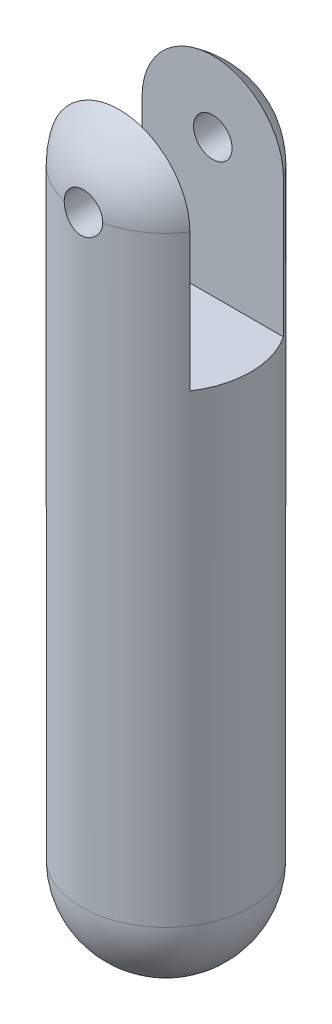
ISO-10303-21;
HEADER;
FILE_DESCRIPTION(('STEP AP214'),'2;1');
FILE_NAME('part.step','',(''),(''),'','','');
FILE_SCHEMA(('AUTOMOTIVE_DESIGN { 1 0 10303 214 1 1 1 1 }'));
ENDSEC;
DATA;
#1=APPLICATION_CONTEXT('core data for automotive mechanical design processes');
#2=APPLICATION_PROTOCOL_DEFINITION('international standard','automotive_design',2000,#1);
#3=PRODUCT_CONTEXT('',#1,'mechanical');
#4=PRODUCT('Part','Part','',(#3));
#5=PRODUCT_RELATED_PRODUCT_CATEGORY('part','',(#4));
#6=PRODUCT_DEFINITION_FORMATION('','',#4);
#7=PRODUCT_DEFINITION_CONTEXT('part definition',#1,'design');
#8=PRODUCT_DEFINITION('design','',#6,#7);
#9=PRODUCT_DEFINITION_SHAPE('','',#8);
#10=(LENGTH_UNIT() NAMED_UNIT(*) SI_UNIT(.MILLI.,.METRE.));
#11=(NAMED_UNIT(*) PLANE_ANGLE_UNIT() SI_UNIT($,.RADIAN.));
#12=(NAMED_UNIT(*) SI_UNIT($,.STERADIAN.) SOLID_ANGLE_UNIT());
#13=UNCERTAINTY_MEASURE_WITH_UNIT(LENGTH_MEASURE(1.E-05),#10,'distance_accuracy_value','');
#14=(GEOMETRIC_REPRESENTATION_CONTEXT(3) GLOBAL_UNCERTAINTY_ASSIGNED_CONTEXT((#13)) GLOBAL_UNIT_ASSIGNED_CONTEXT((#10,
#11,#12)) REPRESENTATION_CONTEXT('',''));
#15=CARTESIAN_POINT('',(0.,0.,0.));
#16=DIRECTION('',(0.,0.,1.));
#17=DIRECTION('',(1.,0.,0.));
#18=AXIS2_PLACEMENT_3D('',#15,#16,#17);
#19=CARTESIAN_POINT('',(0.,0.,0.));
#20=DIRECTION('',(0.,-1.,0.));
#21=DIRECTION('',(1.,0.,0.));
#22=AXIS2_PLACEMENT_3D('',#19,#20,#21);
#23=CYLINDRICAL_SURFACE('',#22,1.9558);
#24=CARTESIAN_POINT('',(0.,-13.8684,0.));
#25=DIRECTION('',(0.,-1.,0.));
#26=DIRECTION('',(1.,0.,0.));
#27=AXIS2_PLACEMENT_3D('',#24,#25,#26);
#28=CIRCLE('',#27,1.9558);
#29=CARTESIAN_POINT('',(1.9558,-13.8684,0.));
#30=VERTEX_POINT('',#29);
#31=EDGE_CURVE('E107',#30,#30,#28,.T.);
#32=ORIENTED_EDGE('',*,*,#31,.F.);
#33=EDGE_LOOP('',(#32));
#34=FACE_BOUND('',#33,.T.);
#35=CARTESIAN_POINT('',(0.,0.,0.));
#36=DIRECTION('',(0.,-1.,0.));
#37=DIRECTION('',(1.,0.,0.));
#38=AXIS2_PLACEMENT_3D('',#35,#36,#37);
#39=CIRCLE('',#38,1.9558);
#40=CARTESIAN_POINT('',(1.63089956465749,0.,1.0795));
#41=VERTEX_POINT('',#40);
#42=CARTESIAN_POINT('',(0.4445,0.,1.90461896189238));
#43=VERTEX_POINT('',#42);
#44=EDGE_CURVE('E93',#41,#43,#39,.T.);
#45=ORIENTED_EDGE('',*,*,#44,.T.);
#46=CARTESIAN_POINT('',(0.4445,0.,1.90461896189238));
#47=CARTESIAN_POINT('',(0.44452273001284,-0.0246635968022245,1.90460001005423));
#48=CARTESIAN_POINT('',(0.442448800622915,-0.0493134063288643,1.90509753542933));
#49=CARTESIAN_POINT('',(0.434284365112343,-0.0978598865842544,1.90698240428573));
#50=CARTESIAN_POINT('',(0.42820112347571,-0.121757837707106,1.90836813829481));
#51=CARTESIAN_POINT('',(0.412193611376415,-0.168169204235372,1.91188725232877));
#52=CARTESIAN_POINT('',(0.402269321359488,-0.190682612591588,1.91402063615983));
#53=CARTESIAN_POINT('',(0.378879685436702,-0.233731370625052,1.91878783812066));
#54=CARTESIAN_POINT('',(0.365413669515942,-0.254266345021712,1.92142175091306));
#55=CARTESIAN_POINT('',(0.33506218365826,-0.293140943529835,1.92694779611436));
#56=CARTESIAN_POINT('',(0.318124709604863,-0.311439476578559,1.92984342871888));
#57=CARTESIAN_POINT('',(0.281422139972595,-0.344963277211342,1.93553600091458));
#58=CARTESIAN_POINT('',(0.261656600772462,-0.360188061730215,1.93833292493596));
#59=CARTESIAN_POINT('',(0.219580718133937,-0.387295530073583,1.94355131390343));
#60=CARTESIAN_POINT('',(0.197243959734308,-0.399138183030924,1.94596814080593));
#61=CARTESIAN_POINT('',(0.150834283476316,-0.418885372056951,1.95011400631086));
#62=CARTESIAN_POINT('',(0.126761666981976,-0.426790589832237,1.95184316396223));
#63=CARTESIAN_POINT('',(0.0779932409427805,-0.438308600582936,1.95439417745114));
#64=CARTESIAN_POINT('',(0.0533147789880289,-0.441991510205409,1.95523083749664));
#65=CARTESIAN_POINT('',(0.00367648660715528,-0.445179834956215,1.95595396454403));
#66=CARTESIAN_POINT('',(-0.0212833153022637,-0.444685669738405,1.95584052699841));
#67=CARTESIAN_POINT('',(-0.0702904622039241,-0.439585468587378,1.95468744165034));
#68=CARTESIAN_POINT('',(-0.0943461461723642,-0.435055134472248,1.95366484660914));
#69=CARTESIAN_POINT('',(-0.141346393355104,-0.422132141926034,1.95082789725655));
#70=CARTESIAN_POINT('',(-0.164290912841336,-0.413739331629783,1.94901351181361));
#71=CARTESIAN_POINT('',(-0.208625393672722,-0.393264054755667,1.94476974181478));
#72=CARTESIAN_POINT('',(-0.230001823601263,-0.381153301022523,1.94233566761055));
#73=CARTESIAN_POINT('',(-0.270445708646846,-0.353607386211707,1.93711878216214));
#74=CARTESIAN_POINT('',(-0.289512889181942,-0.338171830402625,1.93433592952628));
#75=CARTESIAN_POINT('',(-0.325246204687189,-0.304006145887558,1.92865332755163));
#76=CARTESIAN_POINT('',(-0.341849208181335,-0.285210139029779,1.92575235553995));
#77=CARTESIAN_POINT('',(-0.371684010430429,-0.245064644347421,1.92021760097455));
#78=CARTESIAN_POINT('',(-0.384914887550258,-0.223714460779131,1.91758389158443));
#79=CARTESIAN_POINT('',(-0.407661789140926,-0.178955657272013,1.91287780095361));
#80=CARTESIAN_POINT('',(-0.417162924718296,-0.155539235276379,1.9108076793914));
#81=CARTESIAN_POINT('',(-0.4320631439304,-0.10739818988529,1.90749425404484));
#82=CARTESIAN_POINT('',(-0.437468339165815,-0.0826755746779893,1.90624971874064));
#83=CARTESIAN_POINT('',(-0.441993413307874,-0.0481221100137197,1.90520248188666));
#84=CARTESIAN_POINT('',(-0.442933630257451,-0.0385148214803054,1.90498395072954));
#85=CARTESIAN_POINT('',(-0.444186174887239,-0.0192731734323209,1.90469228402986));
#86=CARTESIAN_POINT('',(-0.444499539564846,-0.00963888507402481,1.90461890835981));
#87=CARTESIAN_POINT('',(-0.444500000000006,0.,1.90461896189246));
#88=B_SPLINE_CURVE_WITH_KNOTS('',3,(#46,#47,#48,#49,#50,#51,#52,#53,#54,#55,#56,#57,#58,#59,#60,
#61,#62,#63,#64,#65,#66,#67,#68,#69,#70,#71,#72,#73,#74,#75,#76,#77,#78,#79,#80,#81,#82,#83,#84,
#85,#86,#87),.UNSPECIFIED.,.F.,.F.,(4,2,2,2,2,2,2,2,2,2,2,2,2,2,2,2,2,2,2,2,4),(0.,
0.073877677664881,0.147621862809744,0.221366423381347,0.29512494481257,0.370081890302293,
0.445050606746095,0.520872997321321,0.596682255843713,0.671213492685012,0.745737241762632,
0.818891989685503,0.892049614158744,0.965778247488477,1.03951563895285,1.11489978317361,
1.19030450857748,1.26600725619818,1.34159682322518,1.37054688810836,1.39944902136113),.UNSPECIFIED.);
#89=CARTESIAN_POINT('',(-0.4445,0.,1.90461896189238));
#90=VERTEX_POINT('',#89);
#91=EDGE_CURVE('E57',#43,#90,#88,.T.);
#92=ORIENTED_EDGE('',*,*,#91,.T.);
#93=CARTESIAN_POINT('',(-1.63089956465749,0.,1.0795));
#94=VERTEX_POINT('',#93);
#95=EDGE_CURVE('E89',#90,#94,#39,.T.);
#96=ORIENTED_EDGE('',*,*,#95,.T.);
#97=DIRECTION('',(0.,-1.,0.));
#98=VECTOR('',#97,1.);
#99=CARTESIAN_POINT('',(-1.63089956465749,0.,1.0795));
#100=LINE('',#99,#98);
#101=CARTESIAN_POINT('',(-1.63089956465749,-3.175,1.0795));
#102=VERTEX_POINT('',#101);
#103=EDGE_CURVE('E121',#94,#102,#100,.T.);
#104=ORIENTED_EDGE('',*,*,#103,.T.);
#105=CARTESIAN_POINT('',(0.,-3.175,0.));
#106=DIRECTION('',(0.,1.,0.));
#107=DIRECTION('',(0.,0.,1.));
#108=AXIS2_PLACEMENT_3D('',#105,#106,#107);
#109=CIRCLE('',#108,1.9558);
#110=CARTESIAN_POINT('',(-1.63089956465749,-3.175,-1.0795));
#111=VERTEX_POINT('',#110);
#112=EDGE_CURVE('E11',#111,#102,#109,.T.);
#113=ORIENTED_EDGE('',*,*,#112,.F.);
#114=DIRECTION('',(0.,-1.,0.));
#115=VECTOR('',#114,1.);
#116=CARTESIAN_POINT('',(-1.63089956465749,0.,-1.0795));
#117=LINE('',#116,#115);
#118=CARTESIAN_POINT('',(-1.63089956465749,0.,-1.0795));
#119=VERTEX_POINT('',#118);
#120=EDGE_CURVE('E111',#119,#111,#117,.T.);
#121=ORIENTED_EDGE('',*,*,#120,.F.);
#122=CARTESIAN_POINT('',(-0.4445,0.,-1.90461896189238));
#123=VERTEX_POINT('',#122);
#124=EDGE_CURVE('E104',#119,#123,#39,.T.);
#125=ORIENTED_EDGE('',*,*,#124,.T.);
#126=CARTESIAN_POINT('',(-0.4445,0.,-1.90461896189238));
#127=CARTESIAN_POINT('',(-0.444522730012841,-0.0246635968022246,-1.90460001005423));
#128=CARTESIAN_POINT('',(-0.442448800622915,-0.0493134063288643,-1.90509753542933));
#129=CARTESIAN_POINT('',(-0.434284365112343,-0.0978598865842546,-1.90698240428573));
#130=CARTESIAN_POINT('',(-0.42820112347571,-0.121757837707106,-1.90836813829481));
#131=CARTESIAN_POINT('',(-0.412193611376415,-0.168169204235372,-1.91188725232877));
#132=CARTESIAN_POINT('',(-0.402269321359488,-0.190682612591588,-1.91402063615983));
#133=CARTESIAN_POINT('',(-0.378879685436702,-0.233731370625053,-1.91878783812066));
#134=CARTESIAN_POINT('',(-0.365413669515942,-0.254266345021713,-1.92142175091306));
#135=CARTESIAN_POINT('',(-0.33506218365826,-0.293140943529835,-1.92694779611436));
#136=CARTESIAN_POINT('',(-0.318124709604863,-0.311439476578559,-1.92984342871888));
#137=CARTESIAN_POINT('',(-0.281422139972595,-0.344963277211342,-1.93553600091458));
#138=CARTESIAN_POINT('',(-0.261656600772462,-0.360188061730215,-1.93833292493596));
#139=CARTESIAN_POINT('',(-0.219580718133937,-0.387295530073583,-1.94355131390343));
#140=CARTESIAN_POINT('',(-0.197243959734308,-0.399138183030924,-1.94596814080593));
#141=CARTESIAN_POINT('',(-0.150834283476316,-0.418885372056951,-1.95011400631086));
#142=CARTESIAN_POINT('',(-0.126761666981976,-0.426790589832237,-1.95184316396223));
#143=CARTESIAN_POINT('',(-0.0779932409427803,-0.438308600582936,-1.95439417745114));
#144=CARTESIAN_POINT('',(-0.0533147789880287,-0.441991510205409,-1.95523083749664));
#145=CARTESIAN_POINT('',(-0.00367648660715501,-0.445179834956215,-1.95595396454403));
#146=CARTESIAN_POINT('',(0.021283315302264,-0.444685669738405,-1.95584052699841));
#147=CARTESIAN_POINT('',(0.0702904622039244,-0.439585468587378,-1.95468744165034));
#148=CARTESIAN_POINT('',(0.0943461461723645,-0.435055134472248,-1.95366484660914));
#149=CARTESIAN_POINT('',(0.141346393355104,-0.422132141926034,-1.95082789725655));
#150=CARTESIAN_POINT('',(0.164290912841337,-0.413739331629783,-1.94901351181361));
#151=CARTESIAN_POINT('',(0.208625393672723,-0.393264054755667,-1.94476974181478));
#152=CARTESIAN_POINT('',(0.230001823601264,-0.381153301022522,-1.94233566761055));
#153=CARTESIAN_POINT('',(0.270445708646847,-0.353607386211707,-1.93711878216214));
#154=CARTESIAN_POINT('',(0.289512889181942,-0.338171830402625,-1.93433592952628));
#155=CARTESIAN_POINT('',(0.325246204687189,-0.304006145887558,-1.92865332755163));
#156=CARTESIAN_POINT('',(0.341849208181336,-0.285210139029779,-1.92575235553995));
#157=CARTESIAN_POINT('',(0.371684010430429,-0.24506464434742,-1.92021760097455));
#158=CARTESIAN_POINT('',(0.384914887550258,-0.223714460779131,-1.91758389158443));
#159=CARTESIAN_POINT('',(0.407661789140926,-0.178955657272013,-1.91287780095361));
#160=CARTESIAN_POINT('',(0.417162924718296,-0.155539235276379,-1.9108076793914));
#161=CARTESIAN_POINT('',(0.4320631439304,-0.10739818988529,-1.90749425404484));
#162=CARTESIAN_POINT('',(0.437468339165815,-0.0826755746779891,-1.90624971874064));
#163=CARTESIAN_POINT('',(0.441993413307874,-0.0481221100137195,-1.90520248188666));
#164=CARTESIAN_POINT('',(0.442933630257451,-0.0385148214803052,-1.90498395072954));
#165=CARTESIAN_POINT('',(0.444186174887239,-0.0192731734323209,-1.90469228402986));
#166=CARTESIAN_POINT('',(0.444499539564846,-0.00963888507402473,-1.90461890835981));
#167=CARTESIAN_POINT('',(0.444500000000006,0.,-1.90461896189246));
#168=B_SPLINE_CURVE_WITH_KNOTS('',3,(#126,#127,#128,#129,#130,#131,#132,#133,#134,#135,#136,
#137,#138,#139,#140,#141,#142,#143,#144,#145,#146,#147,#148,#149,#150,#151,#152,#153,#154,#155,
#156,#157,#158,#159,#160,#161,#162,#163,#164,#165,#166,#167),.UNSPECIFIED.,.F.,.F.,(4,2,2,2,2,2,
2,2,2,2,2,2,2,2,2,2,2,2,2,2,4),(0.,0.0738776776648811,0.147621862809744,0.221366423381347,
0.295124944812571,0.370081890302293,0.445050606746095,0.520872997321321,0.596682255843713,
0.671213492685012,0.745737241762633,0.818891989685504,0.892049614158745,0.965778247488477,
1.03951563895285,1.11489978317361,1.19030450857748,1.26600725619818,1.34159682322518,
1.37054688810836,1.39944902136113),.UNSPECIFIED.);
#169=CARTESIAN_POINT('',(0.4445,0.,-1.90461896189238));
#170=VERTEX_POINT('',#169);
#171=EDGE_CURVE('E50',#123,#170,#168,.T.);
#172=ORIENTED_EDGE('',*,*,#171,.T.);
#173=CARTESIAN_POINT('',(1.63089956465749,0.,-1.0795));
#174=VERTEX_POINT('',#173);
#175=EDGE_CURVE('E106',#170,#174,#39,.T.);
#176=ORIENTED_EDGE('',*,*,#175,.T.);
#177=DIRECTION('',(0.,-1.,0.));
#178=VECTOR('',#177,1.);
#179=CARTESIAN_POINT('',(1.63089956465749,0.,-1.0795));
#180=LINE('',#179,#178);
#181=CARTESIAN_POINT('',(1.63089956465749,-3.175,-1.0795));
#182=VERTEX_POINT('',#181);
#183=EDGE_CURVE('E116',#182,#174,#180,.F.);
#184=ORIENTED_EDGE('',*,*,#183,.F.);
#185=CARTESIAN_POINT('',(1.63089956465749,-3.175,1.0795));
#186=VERTEX_POINT('',#185);
#187=EDGE_CURVE('E44',#186,#182,#109,.T.);
#188=ORIENTED_EDGE('',*,*,#187,.F.);
#189=DIRECTION('',(0.,-1.,0.));
#190=VECTOR('',#189,1.);
#191=CARTESIAN_POINT('',(1.63089956465749,0.,1.0795));
#192=LINE('',#191,#190);
#193=EDGE_CURVE('E125',#186,#41,#192,.F.);
#194=ORIENTED_EDGE('',*,*,#193,.T.);
#195=EDGE_LOOP('',(#45,#92,#96,#104,#113,#121,#125,#172,#176,#184,#188,#194));
#196=FACE_BOUND('',#195,.T.);
#197=ADVANCED_FACE('F35',(#34,#196),#23,.T.);
#198=CARTESIAN_POINT('',(0.,0.,0.));
#199=DIRECTION('',(0.,-1.,0.));
#200=DIRECTION('',(1.,0.,0.));
#201=AXIS2_PLACEMENT_3D('',#198,#199,#200);
#202=SPHERICAL_SURFACE('',#201,1.9558);
#203=ORIENTED_EDGE('',*,*,#175,.F.);
#204=CARTESIAN_POINT('',(0.,0.,-1.90461896189238));
#205=DIRECTION('',(0.,0.,1.));
#206=DIRECTION('',(1.,0.,0.));
#207=AXIS2_PLACEMENT_3D('',#204,#205,#206);
#208=CIRCLE('',#207,0.4445);
#209=EDGE_CURVE('E94',#170,#123,#208,.T.);
#210=ORIENTED_EDGE('',*,*,#209,.T.);
#211=ORIENTED_EDGE('',*,*,#124,.F.);
#212=CARTESIAN_POINT('',(0.,0.,-1.0795));
#213=DIRECTION('',(0.,0.,1.));
#214=DIRECTION('',(0.,-1.,0.));
#215=AXIS2_PLACEMENT_3D('',#212,#213,#214);
#216=CIRCLE('',#215,1.63089956465749);
#217=EDGE_CURVE('E173',#174,#119,#216,.T.);
#218=ORIENTED_EDGE('',*,*,#217,.F.);
#219=EDGE_LOOP('',(#203,#210,#211,#218));
#220=FACE_BOUND('',#219,.T.);
#221=ADVANCED_FACE('F162',(#220),#202,.T.);
#222=CARTESIAN_POINT('',(0.,-13.8684,0.));
#223=DIRECTION('',(0.,-1.,0.));
#224=DIRECTION('',(-1.,0.,0.));
#225=AXIS2_PLACEMENT_3D('',#222,#223,#224);
#226=SPHERICAL_SURFACE('',#225,1.9558);
#227=ORIENTED_EDGE('',*,*,#31,.T.);
#228=EDGE_LOOP('',(#227));
#229=FACE_BOUND('',#228,.T.);
#230=ADVANCED_FACE('F167',(#229),#226,.T.);
#231=ORIENTED_EDGE('',*,*,#95,.F.);
#232=CARTESIAN_POINT('',(0.,0.,1.90461896189238));
#233=DIRECTION('',(0.,0.,-1.));
#234=DIRECTION('',(-1.,0.,0.));
#235=AXIS2_PLACEMENT_3D('',#232,#233,#234);
#236=CIRCLE('',#235,0.4445);
#237=EDGE_CURVE('E95',#90,#43,#236,.T.);
#238=ORIENTED_EDGE('',*,*,#237,.T.);
#239=ORIENTED_EDGE('',*,*,#44,.F.);
#240=CARTESIAN_POINT('',(0.,0.,1.0795));
#241=DIRECTION('',(0.,0.,1.));
#242=DIRECTION('',(0.,-1.,0.));
#243=AXIS2_PLACEMENT_3D('',#240,#241,#242);
#244=CIRCLE('',#243,1.63089956465749);
#245=EDGE_CURVE('E103',#41,#94,#244,.T.);
#246=ORIENTED_EDGE('',*,*,#245,.T.);
#247=EDGE_LOOP('',(#231,#238,#239,#246));
#248=FACE_BOUND('',#247,.T.);
#249=ADVANCED_FACE('F102',(#248),#202,.T.);
#250=CARTESIAN_POINT('',(-1.9558,-3.175,-1.0795));
#251=DIRECTION('',(0.,1.,0.));
#252=DIRECTION('',(0.,0.,1.));
#253=AXIS2_PLACEMENT_3D('',#250,#251,#252);
#254=PLANE('',#253);
#255=DIRECTION('',(1.,0.,0.));
#256=VECTOR('',#255,1.);
#257=CARTESIAN_POINT('',(-1.9558,-3.175,1.0795));
#258=LINE('',#257,#256);
#259=EDGE_CURVE('E129',#102,#186,#258,.T.);
#260=ORIENTED_EDGE('',*,*,#259,.T.);
#261=ORIENTED_EDGE('',*,*,#187,.T.);
#262=DIRECTION('',(1.,0.,0.));
#263=VECTOR('',#262,1.);
#264=CARTESIAN_POINT('',(-1.9558,-3.175,-1.0795));
#265=LINE('',#264,#263);
#266=EDGE_CURVE('E127',#111,#182,#265,.T.);
#267=ORIENTED_EDGE('',*,*,#266,.F.);
#268=ORIENTED_EDGE('',*,*,#112,.T.);
#269=EDGE_LOOP('',(#260,#261,#267,#268));
#270=FACE_BOUND('',#269,.T.);
#271=ADVANCED_FACE('F177',(#270),#254,.T.);
#272=CARTESIAN_POINT('',(-1.9558,2.13936720514233,-1.0795));
#273=DIRECTION('',(0.,0.,1.));
#274=DIRECTION('',(0.,-1.,0.));
#275=AXIS2_PLACEMENT_3D('',#272,#273,#274);
#276=PLANE('',#275);
#277=CARTESIAN_POINT('',(0.,0.,-1.0795));
#278=DIRECTION('',(0.,0.,1.));
#279=DIRECTION('',(0.,-1.,0.));
#280=AXIS2_PLACEMENT_3D('',#277,#278,#279);
#281=CIRCLE('',#280,0.4445);
#282=CARTESIAN_POINT('',(0.,-0.4445,-1.0795));
#283=VERTEX_POINT('',#282);
#284=EDGE_CURVE('E99',#283,#283,#281,.T.);
#285=ORIENTED_EDGE('',*,*,#284,.F.);
#286=EDGE_LOOP('',(#285));
#287=FACE_BOUND('',#286,.T.);
#288=ORIENTED_EDGE('',*,*,#120,.T.);
#289=ORIENTED_EDGE('',*,*,#266,.T.);
#290=ORIENTED_EDGE('',*,*,#183,.T.);
#291=ORIENTED_EDGE('',*,*,#217,.T.);
#292=EDGE_LOOP('',(#288,#289,#290,#291));
#293=FACE_BOUND('',#292,.T.);
#294=ADVANCED_FACE('F160',(#287,#293),#276,.T.);
#295=CARTESIAN_POINT('',(-1.9558,2.13936720514233,1.0795));
#296=DIRECTION('',(0.,0.,1.));
#297=DIRECTION('',(0.,-1.,0.));
#298=AXIS2_PLACEMENT_3D('',#295,#296,#297);
#299=PLANE('',#298);
#300=CARTESIAN_POINT('',(0.,0.,1.0795));
#301=DIRECTION('',(0.,0.,1.));
#302=DIRECTION('',(0.,-1.,0.));
#303=AXIS2_PLACEMENT_3D('',#300,#301,#302);
#304=CIRCLE('',#303,0.4445);
#305=CARTESIAN_POINT('',(0.,-0.4445,1.0795));
#306=VERTEX_POINT('',#305);
#307=EDGE_CURVE('E39',#306,#306,#304,.T.);
#308=ORIENTED_EDGE('',*,*,#307,.T.);
#309=EDGE_LOOP('',(#308));
#310=FACE_BOUND('',#309,.T.);
#311=ORIENTED_EDGE('',*,*,#245,.F.);
#312=ORIENTED_EDGE('',*,*,#193,.F.);
#313=ORIENTED_EDGE('',*,*,#259,.F.);
#314=ORIENTED_EDGE('',*,*,#103,.F.);
#315=EDGE_LOOP('',(#311,#312,#313,#314));
#316=FACE_BOUND('',#315,.T.);
#317=ADVANCED_FACE('F142',(#310,#316),#299,.F.);
#318=CARTESIAN_POINT('',(0.,0.,-1.9558));
#319=DIRECTION('',(0.,0.,1.));
#320=DIRECTION('',(1.,0.,0.));
#321=AXIS2_PLACEMENT_3D('',#318,#319,#320);
#322=CYLINDRICAL_SURFACE('',#321,0.4445);
#323=ORIENTED_EDGE('',*,*,#307,.F.);
#324=EDGE_LOOP('',(#323));
#325=FACE_BOUND('',#324,.T.);
#326=ORIENTED_EDGE('',*,*,#237,.F.);
#327=ORIENTED_EDGE('',*,*,#91,.F.);
#328=EDGE_LOOP('',(#326,#327));
#329=FACE_BOUND('',#328,.T.);
#330=ADVANCED_FACE('F97',(#325,#329),#322,.F.);
#331=ORIENTED_EDGE('',*,*,#284,.T.);
#332=EDGE_LOOP('',(#331));
#333=FACE_BOUND('',#332,.T.);
#334=ORIENTED_EDGE('',*,*,#209,.F.);
#335=ORIENTED_EDGE('',*,*,#171,.F.);
#336=EDGE_LOOP('',(#334,#335));
#337=FACE_BOUND('',#336,.T.);
#338=ADVANCED_FACE('F137',(#333,#337),#322,.F.);
#339=CLOSED_SHELL('',(#197,#221,#230,#249,#271,#294,#317,#330,#338));
#340=MANIFOLD_SOLID_BREP('B2',#339);
#341=ADVANCED_BREP_SHAPE_REPRESENTATION('',(#18,#340),#14);
#342=SHAPE_DEFINITION_REPRESENTATION(#9,#341);
ENDSEC;
END-ISO-10303-21;
